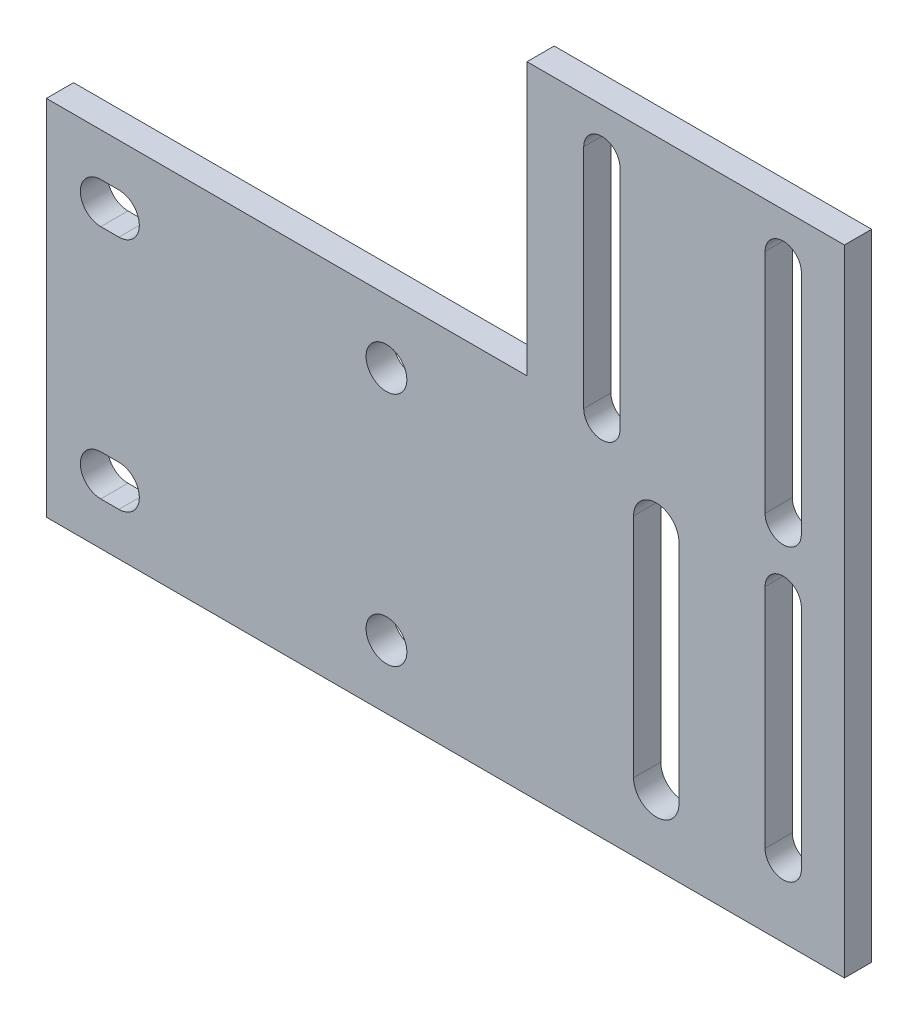
ISO-10303-21;
HEADER;
FILE_DESCRIPTION(('STEP AP214'),'2;1');
FILE_NAME('part.step','',(''),(''),'','','');
FILE_SCHEMA(('AUTOMOTIVE_DESIGN { 1 0 10303 214 1 1 1 1 }'));
ENDSEC;
DATA;
#1=APPLICATION_CONTEXT('core data for automotive mechanical design processes');
#2=APPLICATION_PROTOCOL_DEFINITION('international standard','automotive_design',2000,#1);
#3=PRODUCT_CONTEXT('',#1,'mechanical');
#4=PRODUCT('Part','Part','',(#3));
#5=PRODUCT_RELATED_PRODUCT_CATEGORY('part','',(#4));
#6=PRODUCT_DEFINITION_FORMATION('','',#4);
#7=PRODUCT_DEFINITION_CONTEXT('part definition',#1,'design');
#8=PRODUCT_DEFINITION('design','',#6,#7);
#9=PRODUCT_DEFINITION_SHAPE('','',#8);
#10=(LENGTH_UNIT() NAMED_UNIT(*) SI_UNIT(.MILLI.,.METRE.));
#11=(NAMED_UNIT(*) PLANE_ANGLE_UNIT() SI_UNIT($,.RADIAN.));
#12=(NAMED_UNIT(*) SI_UNIT($,.STERADIAN.) SOLID_ANGLE_UNIT());
#13=UNCERTAINTY_MEASURE_WITH_UNIT(LENGTH_MEASURE(1.E-05),#10,'distance_accuracy_value','');
#14=(GEOMETRIC_REPRESENTATION_CONTEXT(3) GLOBAL_UNCERTAINTY_ASSIGNED_CONTEXT((#13)) GLOBAL_UNIT_ASSIGNED_CONTEXT((#10,
#11,#12)) REPRESENTATION_CONTEXT('',''));
#15=CARTESIAN_POINT('',(0.,0.,0.));
#16=DIRECTION('',(0.,0.,1.));
#17=DIRECTION('',(1.,0.,0.));
#18=AXIS2_PLACEMENT_3D('',#15,#16,#17);
#19=CARTESIAN_POINT('',(0.,0.,3.));
#20=DIRECTION('',(0.,0.,-1.));
#21=DIRECTION('',(-1.,0.,0.));
#22=AXIS2_PLACEMENT_3D('',#19,#20,#21);
#23=PLANE('',#22);
#24=CARTESIAN_POINT('',(59.0000000000004,-11.9999999999996,3.));
#25=DIRECTION('',(0.,0.,1.));
#26=DIRECTION('',(1.,0.,0.));
#27=AXIS2_PLACEMENT_3D('',#24,#25,#26);
#28=CIRCLE('',#27,1.99999999999966);
#29=CARTESIAN_POINT('',(57.0000000000007,-11.9999999999996,3.));
#30=VERTEX_POINT('',#29);
#31=CARTESIAN_POINT('',(61.,-11.9999999999996,3.));
#32=VERTEX_POINT('',#31);
#33=EDGE_CURVE('E285',#30,#32,#28,.T.);
#34=ORIENTED_EDGE('',*,*,#33,.F.);
#35=DIRECTION('',(0.,-1.,0.));
#36=VECTOR('',#35,1.);
#37=CARTESIAN_POINT('',(57.0000000000007,-11.9999999999996,3.));
#38=LINE('',#37,#36);
#39=CARTESIAN_POINT('',(57.0000000000007,13.0000000000004,3.));
#40=VERTEX_POINT('',#39);
#41=EDGE_CURVE('E296',#40,#30,#38,.T.);
#42=ORIENTED_EDGE('',*,*,#41,.F.);
#43=CARTESIAN_POINT('',(59.0000000000003,13.0000000000004,3.));
#44=DIRECTION('',(0.,0.,1.));
#45=DIRECTION('',(1.,0.,0.));
#46=AXIS2_PLACEMENT_3D('',#43,#44,#45);
#47=CIRCLE('',#46,1.99999999999965);
#48=CARTESIAN_POINT('',(61.,13.0000000000004,3.));
#49=VERTEX_POINT('',#48);
#50=EDGE_CURVE('E292',#49,#40,#47,.T.);
#51=ORIENTED_EDGE('',*,*,#50,.F.);
#52=DIRECTION('',(0.,1.,0.));
#53=VECTOR('',#52,1.);
#54=CARTESIAN_POINT('',(61.,-11.9999999999996,3.));
#55=LINE('',#54,#53);
#56=EDGE_CURVE('E288',#32,#49,#55,.T.);
#57=ORIENTED_EDGE('',*,*,#56,.F.);
#58=EDGE_LOOP('',(#34,#42,#51,#57));
#59=FACE_BOUND('',#58,.T.);
#60=CARTESIAN_POINT('',(45.,-12.5,3.));
#61=DIRECTION('',(0.,0.,1.));
#62=DIRECTION('',(1.,0.,0.));
#63=AXIS2_PLACEMENT_3D('',#60,#61,#62);
#64=CIRCLE('',#63,2.5);
#65=CARTESIAN_POINT('',(42.5,-12.5,3.));
#66=VERTEX_POINT('',#65);
#67=CARTESIAN_POINT('',(47.5,-12.5,3.));
#68=VERTEX_POINT('',#67);
#69=EDGE_CURVE('E371',#66,#68,#64,.T.);
#70=ORIENTED_EDGE('',*,*,#69,.F.);
#71=DIRECTION('',(0.,-1.,0.));
#72=VECTOR('',#71,1.);
#73=CARTESIAN_POINT('',(42.5,-12.5,3.));
#74=LINE('',#73,#72);
#75=CARTESIAN_POINT('',(42.5,12.5,3.));
#76=VERTEX_POINT('',#75);
#77=EDGE_CURVE('E382',#76,#66,#74,.T.);
#78=ORIENTED_EDGE('',*,*,#77,.F.);
#79=CARTESIAN_POINT('',(45.,12.5,3.));
#80=DIRECTION('',(0.,0.,1.));
#81=DIRECTION('',(1.,0.,0.));
#82=AXIS2_PLACEMENT_3D('',#79,#80,#81);
#83=CIRCLE('',#82,2.5);
#84=CARTESIAN_POINT('',(47.5,12.5,3.));
#85=VERTEX_POINT('',#84);
#86=EDGE_CURVE('E378',#85,#76,#83,.T.);
#87=ORIENTED_EDGE('',*,*,#86,.F.);
#88=DIRECTION('',(0.,1.,0.));
#89=VECTOR('',#88,1.);
#90=CARTESIAN_POINT('',(47.5,-12.5,3.));
#91=LINE('',#90,#89);
#92=EDGE_CURVE('E374',#68,#85,#91,.T.);
#93=ORIENTED_EDGE('',*,*,#92,.F.);
#94=EDGE_LOOP('',(#70,#78,#87,#93));
#95=FACE_BOUND('',#94,.T.);
#96=CARTESIAN_POINT('',(-14.25,13.,3.));
#97=DIRECTION('',(0.,0.,1.));
#98=DIRECTION('',(1.,0.,0.));
#99=AXIS2_PLACEMENT_3D('',#96,#97,#98);
#100=CIRCLE('',#99,2.25);
#101=CARTESIAN_POINT('',(-14.25,10.75,3.));
#102=VERTEX_POINT('',#101);
#103=CARTESIAN_POINT('',(-14.25,15.25,3.));
#104=VERTEX_POINT('',#103);
#105=EDGE_CURVE('E457',#102,#104,#100,.T.);
#106=ORIENTED_EDGE('',*,*,#105,.F.);
#107=DIRECTION('',(1.,0.,0.));
#108=VECTOR('',#107,1.);
#109=CARTESIAN_POINT('',(-14.25,10.75,3.));
#110=LINE('',#109,#108);
#111=CARTESIAN_POINT('',(-16.25,10.75,3.));
#112=VERTEX_POINT('',#111);
#113=EDGE_CURVE('E468',#112,#102,#110,.T.);
#114=ORIENTED_EDGE('',*,*,#113,.F.);
#115=CARTESIAN_POINT('',(-16.25,13.,3.));
#116=DIRECTION('',(0.,0.,1.));
#117=DIRECTION('',(1.,0.,0.));
#118=AXIS2_PLACEMENT_3D('',#115,#116,#117);
#119=CIRCLE('',#118,2.25);
#120=CARTESIAN_POINT('',(-16.25,15.25,3.));
#121=VERTEX_POINT('',#120);
#122=EDGE_CURVE('E464',#121,#112,#119,.T.);
#123=ORIENTED_EDGE('',*,*,#122,.F.);
#124=DIRECTION('',(-1.,0.,0.));
#125=VECTOR('',#124,1.);
#126=CARTESIAN_POINT('',(-14.25,15.25,3.));
#127=LINE('',#126,#125);
#128=EDGE_CURVE('E460',#104,#121,#127,.T.);
#129=ORIENTED_EDGE('',*,*,#128,.F.);
#130=EDGE_LOOP('',(#106,#114,#123,#129));
#131=FACE_BOUND('',#130,.T.);
#132=DIRECTION('',(-1.,0.,0.));
#133=VECTOR('',#132,1.);
#134=CARTESIAN_POINT('',(30.75,20.,3.));
#135=LINE('',#134,#133);
#136=CARTESIAN_POINT('',(30.75,20.,3.));
#137=VERTEX_POINT('',#136);
#138=CARTESIAN_POINT('',(-22.25,20.,3.));
#139=VERTEX_POINT('',#138);
#140=EDGE_CURVE('E516',#137,#139,#135,.T.);
#141=ORIENTED_EDGE('',*,*,#140,.T.);
#142=DIRECTION('',(0.,-1.,0.));
#143=VECTOR('',#142,1.);
#144=CARTESIAN_POINT('',(-22.25,-20.,3.));
#145=LINE('',#144,#143);
#146=CARTESIAN_POINT('',(-22.25,-20.,3.));
#147=VERTEX_POINT('',#146);
#148=EDGE_CURVE('E520',#139,#147,#145,.T.);
#149=ORIENTED_EDGE('',*,*,#148,.T.);
#150=DIRECTION('',(1.,0.,0.));
#151=VECTOR('',#150,1.);
#152=CARTESIAN_POINT('',(65.75,-20.,3.));
#153=LINE('',#152,#151);
#154=CARTESIAN_POINT('',(65.75,-20.,3.));
#155=VERTEX_POINT('',#154);
#156=EDGE_CURVE('E524',#147,#155,#153,.T.);
#157=ORIENTED_EDGE('',*,*,#156,.T.);
#158=DIRECTION('',(0.,1.,0.));
#159=VECTOR('',#158,1.);
#160=CARTESIAN_POINT('',(65.75,-20.,3.));
#161=LINE('',#160,#159);
#162=CARTESIAN_POINT('',(65.75,50.,3.));
#163=VERTEX_POINT('',#162);
#164=EDGE_CURVE('E527',#155,#163,#161,.T.);
#165=ORIENTED_EDGE('',*,*,#164,.T.);
#166=DIRECTION('',(-1.,0.,0.));
#167=VECTOR('',#166,1.);
#168=CARTESIAN_POINT('',(65.75,50.,3.));
#169=LINE('',#168,#167);
#170=CARTESIAN_POINT('',(30.75,50.,3.));
#171=VERTEX_POINT('',#170);
#172=EDGE_CURVE('E530',#163,#171,#169,.T.);
#173=ORIENTED_EDGE('',*,*,#172,.T.);
#174=DIRECTION('',(0.,-1.,0.));
#175=VECTOR('',#174,1.);
#176=CARTESIAN_POINT('',(30.75,20.,3.));
#177=LINE('',#176,#175);
#178=EDGE_CURVE('E533',#171,#137,#177,.T.);
#179=ORIENTED_EDGE('',*,*,#178,.T.);
#180=EDGE_LOOP('',(#141,#149,#157,#165,#173,#179));
#181=FACE_BOUND('',#180,.T.);
#182=CARTESIAN_POINT('',(15.25,13.,3.));
#183=DIRECTION('',(0.,0.,1.));
#184=DIRECTION('',(1.,0.,0.));
#185=AXIS2_PLACEMENT_3D('',#182,#183,#184);
#186=CIRCLE('',#185,2.25);
#187=CARTESIAN_POINT('',(17.5,13.,3.));
#188=VERTEX_POINT('',#187);
#189=EDGE_CURVE('E508',#188,#188,#186,.T.);
#190=ORIENTED_EDGE('',*,*,#189,.F.);
#191=EDGE_LOOP('',(#190));
#192=FACE_BOUND('',#191,.T.);
#193=CARTESIAN_POINT('',(15.25,-13.,3.));
#194=DIRECTION('',(0.,0.,1.));
#195=DIRECTION('',(1.,0.,0.));
#196=AXIS2_PLACEMENT_3D('',#193,#194,#195);
#197=CIRCLE('',#196,2.25);
#198=CARTESIAN_POINT('',(17.5,-13.,3.));
#199=VERTEX_POINT('',#198);
#200=EDGE_CURVE('E500',#199,#199,#197,.T.);
#201=ORIENTED_EDGE('',*,*,#200,.F.);
#202=EDGE_LOOP('',(#201));
#203=FACE_BOUND('',#202,.T.);
#204=CARTESIAN_POINT('',(-14.25,-13.,3.));
#205=DIRECTION('',(0.,0.,1.));
#206=DIRECTION('',(1.,0.,0.));
#207=AXIS2_PLACEMENT_3D('',#204,#205,#206);
#208=CIRCLE('',#207,2.25);
#209=CARTESIAN_POINT('',(-14.25,-15.25,3.));
#210=VERTEX_POINT('',#209);
#211=CARTESIAN_POINT('',(-14.25,-10.75,3.));
#212=VERTEX_POINT('',#211);
#213=EDGE_CURVE('E414',#210,#212,#208,.T.);
#214=ORIENTED_EDGE('',*,*,#213,.F.);
#215=DIRECTION('',(1.,0.,0.));
#216=VECTOR('',#215,1.);
#217=CARTESIAN_POINT('',(-14.25,-15.25,3.));
#218=LINE('',#217,#216);
#219=CARTESIAN_POINT('',(-16.25,-15.25,3.));
#220=VERTEX_POINT('',#219);
#221=EDGE_CURVE('E425',#220,#210,#218,.T.);
#222=ORIENTED_EDGE('',*,*,#221,.F.);
#223=CARTESIAN_POINT('',(-16.25,-13.,3.));
#224=DIRECTION('',(0.,0.,1.));
#225=DIRECTION('',(1.,0.,0.));
#226=AXIS2_PLACEMENT_3D('',#223,#224,#225);
#227=CIRCLE('',#226,2.25);
#228=CARTESIAN_POINT('',(-16.25,-10.75,3.));
#229=VERTEX_POINT('',#228);
#230=EDGE_CURVE('E421',#229,#220,#227,.T.);
#231=ORIENTED_EDGE('',*,*,#230,.F.);
#232=DIRECTION('',(-1.,0.,0.));
#233=VECTOR('',#232,1.);
#234=CARTESIAN_POINT('',(-14.25,-10.75,3.));
#235=LINE('',#234,#233);
#236=EDGE_CURVE('E417',#212,#229,#235,.T.);
#237=ORIENTED_EDGE('',*,*,#236,.F.);
#238=EDGE_LOOP('',(#214,#222,#231,#237));
#239=FACE_BOUND('',#238,.T.);
#240=CARTESIAN_POINT('',(59.,20.0000000000004,3.));
#241=DIRECTION('',(0.,0.,1.));
#242=DIRECTION('',(1.,0.,0.));
#243=AXIS2_PLACEMENT_3D('',#240,#241,#242);
#244=CIRCLE('',#243,1.99999999999969);
#245=CARTESIAN_POINT('',(57.0000000000003,20.0000000000004,3.));
#246=VERTEX_POINT('',#245);
#247=CARTESIAN_POINT('',(60.9999999999997,20.0000000000004,3.));
#248=VERTEX_POINT('',#247);
#249=EDGE_CURVE('E328',#246,#248,#244,.T.);
#250=ORIENTED_EDGE('',*,*,#249,.F.);
#251=DIRECTION('',(0.,-1.,0.));
#252=VECTOR('',#251,1.);
#253=CARTESIAN_POINT('',(57.0000000000003,20.0000000000004,3.));
#254=LINE('',#253,#252);
#255=CARTESIAN_POINT('',(57.0000000000003,45.0000000000004,3.));
#256=VERTEX_POINT('',#255);
#257=EDGE_CURVE('E339',#256,#246,#254,.T.);
#258=ORIENTED_EDGE('',*,*,#257,.F.);
#259=CARTESIAN_POINT('',(59.,45.0000000000004,3.));
#260=DIRECTION('',(0.,0.,1.));
#261=DIRECTION('',(1.,0.,0.));
#262=AXIS2_PLACEMENT_3D('',#259,#260,#261);
#263=CIRCLE('',#262,1.99999999999968);
#264=CARTESIAN_POINT('',(60.9999999999997,45.0000000000004,3.));
#265=VERTEX_POINT('',#264);
#266=EDGE_CURVE('E335',#265,#256,#263,.T.);
#267=ORIENTED_EDGE('',*,*,#266,.F.);
#268=DIRECTION('',(0.,1.,0.));
#269=VECTOR('',#268,1.);
#270=CARTESIAN_POINT('',(60.9999999999997,20.0000000000004,3.));
#271=LINE('',#270,#269);
#272=EDGE_CURVE('E331',#248,#265,#271,.T.);
#273=ORIENTED_EDGE('',*,*,#272,.F.);
#274=EDGE_LOOP('',(#250,#258,#267,#273));
#275=FACE_BOUND('',#274,.T.);
#276=CARTESIAN_POINT('',(39.0000000000003,20.0000000000003,3.));
#277=DIRECTION('',(0.,0.,1.));
#278=DIRECTION('',(1.,0.,0.));
#279=AXIS2_PLACEMENT_3D('',#276,#277,#278);
#280=CIRCLE('',#279,1.99999999999969);
#281=CARTESIAN_POINT('',(37.0000000000006,20.0000000000003,3.));
#282=VERTEX_POINT('',#281);
#283=CARTESIAN_POINT('',(41.,20.0000000000003,3.));
#284=VERTEX_POINT('',#283);
#285=EDGE_CURVE('E237',#282,#284,#280,.T.);
#286=ORIENTED_EDGE('',*,*,#285,.F.);
#287=DIRECTION('',(0.,-1.,0.));
#288=VECTOR('',#287,1.);
#289=CARTESIAN_POINT('',(37.0000000000006,20.0000000000003,3.));
#290=LINE('',#289,#288);
#291=CARTESIAN_POINT('',(37.0000000000006,45.0000000000003,3.));
#292=VERTEX_POINT('',#291);
#293=EDGE_CURVE('E263',#292,#282,#290,.T.);
#294=ORIENTED_EDGE('',*,*,#293,.F.);
#295=CARTESIAN_POINT('',(39.0000000000003,45.0000000000003,3.));
#296=DIRECTION('',(0.,0.,1.));
#297=DIRECTION('',(1.,0.,0.));
#298=AXIS2_PLACEMENT_3D('',#295,#296,#297);
#299=CIRCLE('',#298,1.99999999999968);
#300=CARTESIAN_POINT('',(41.,45.0000000000003,3.));
#301=VERTEX_POINT('',#300);
#302=EDGE_CURVE('E259',#301,#292,#299,.T.);
#303=ORIENTED_EDGE('',*,*,#302,.F.);
#304=DIRECTION('',(0.,1.,0.));
#305=VECTOR('',#304,1.);
#306=CARTESIAN_POINT('',(41.,20.0000000000003,3.));
#307=LINE('',#306,#305);
#308=EDGE_CURVE('E246',#284,#301,#307,.T.);
#309=ORIENTED_EDGE('',*,*,#308,.F.);
#310=EDGE_LOOP('',(#286,#294,#303,#309));
#311=FACE_BOUND('',#310,.T.);
#312=ADVANCED_FACE('F39',(#59,#95,#131,#181,#192,#203,#239,#275,#311),#23,.F.);
#313=CARTESIAN_POINT('',(0.,0.,0.));
#314=DIRECTION('',(0.,0.,-1.));
#315=DIRECTION('',(-1.,0.,0.));
#316=AXIS2_PLACEMENT_3D('',#313,#314,#315);
#317=PLANE('',#316);
#318=CARTESIAN_POINT('',(15.25,13.,0.));
#319=DIRECTION('',(0.,0.,1.));
#320=DIRECTION('',(1.,0.,0.));
#321=AXIS2_PLACEMENT_3D('',#318,#319,#320);
#322=CIRCLE('',#321,2.25);
#323=CARTESIAN_POINT('',(17.5,13.,0.));
#324=VERTEX_POINT('',#323);
#325=EDGE_CURVE('E504',#324,#324,#322,.T.);
#326=ORIENTED_EDGE('',*,*,#325,.T.);
#327=EDGE_LOOP('',(#326));
#328=FACE_BOUND('',#327,.T.);
#329=DIRECTION('',(-1.,0.,0.));
#330=VECTOR('',#329,1.);
#331=CARTESIAN_POINT('',(30.75,20.,0.));
#332=LINE('',#331,#330);
#333=CARTESIAN_POINT('',(30.75,20.,0.));
#334=VERTEX_POINT('',#333);
#335=CARTESIAN_POINT('',(-22.25,20.,0.));
#336=VERTEX_POINT('',#335);
#337=EDGE_CURVE('E512',#334,#336,#332,.T.);
#338=ORIENTED_EDGE('',*,*,#337,.F.);
#339=DIRECTION('',(0.,-1.,0.));
#340=VECTOR('',#339,1.);
#341=CARTESIAN_POINT('',(30.75,20.,0.));
#342=LINE('',#341,#340);
#343=CARTESIAN_POINT('',(30.75,50.,0.));
#344=VERTEX_POINT('',#343);
#345=EDGE_CURVE('E521',#344,#334,#342,.T.);
#346=ORIENTED_EDGE('',*,*,#345,.F.);
#347=DIRECTION('',(-1.,0.,0.));
#348=VECTOR('',#347,1.);
#349=CARTESIAN_POINT('',(65.75,50.,0.));
#350=LINE('',#349,#348);
#351=CARTESIAN_POINT('',(65.75,50.,0.));
#352=VERTEX_POINT('',#351);
#353=EDGE_CURVE('E550',#352,#344,#350,.T.);
#354=ORIENTED_EDGE('',*,*,#353,.F.);
#355=DIRECTION('',(0.,1.,0.));
#356=VECTOR('',#355,1.);
#357=CARTESIAN_POINT('',(65.75,20.,0.));
#358=LINE('',#357,#356);
#359=CARTESIAN_POINT('',(65.75,-20.,0.));
#360=VERTEX_POINT('',#359);
#361=EDGE_CURVE('E547',#360,#352,#358,.T.);
#362=ORIENTED_EDGE('',*,*,#361,.F.);
#363=DIRECTION('',(1.,0.,0.));
#364=VECTOR('',#363,1.);
#365=CARTESIAN_POINT('',(65.75,-20.,0.));
#366=LINE('',#365,#364);
#367=CARTESIAN_POINT('',(-22.25,-20.,0.));
#368=VERTEX_POINT('',#367);
#369=EDGE_CURVE('E543',#368,#360,#366,.T.);
#370=ORIENTED_EDGE('',*,*,#369,.F.);
#371=DIRECTION('',(0.,-1.,0.));
#372=VECTOR('',#371,1.);
#373=CARTESIAN_POINT('',(-22.25,-20.,0.));
#374=LINE('',#373,#372);
#375=EDGE_CURVE('E540',#336,#368,#374,.T.);
#376=ORIENTED_EDGE('',*,*,#375,.F.);
#377=EDGE_LOOP('',(#338,#346,#354,#362,#370,#376));
#378=FACE_BOUND('',#377,.T.);
#379=CARTESIAN_POINT('',(15.25,-13.,0.));
#380=DIRECTION('',(0.,0.,1.));
#381=DIRECTION('',(1.,0.,0.));
#382=AXIS2_PLACEMENT_3D('',#379,#380,#381);
#383=CIRCLE('',#382,2.25);
#384=CARTESIAN_POINT('',(17.5,-13.,0.));
#385=VERTEX_POINT('',#384);
#386=EDGE_CURVE('E499',#385,#385,#383,.T.);
#387=ORIENTED_EDGE('',*,*,#386,.T.);
#388=EDGE_LOOP('',(#387));
#389=FACE_BOUND('',#388,.T.);
#390=DIRECTION('',(1.,0.,0.));
#391=VECTOR('',#390,1.);
#392=CARTESIAN_POINT('',(-14.25,10.75,0.));
#393=LINE('',#392,#391);
#394=CARTESIAN_POINT('',(-16.25,10.75,0.));
#395=VERTEX_POINT('',#394);
#396=CARTESIAN_POINT('',(-14.25,10.75,0.));
#397=VERTEX_POINT('',#396);
#398=EDGE_CURVE('E461',#395,#397,#393,.T.);
#399=ORIENTED_EDGE('',*,*,#398,.T.);
#400=CARTESIAN_POINT('',(-14.25,13.,0.));
#401=DIRECTION('',(0.,0.,1.));
#402=DIRECTION('',(1.,0.,0.));
#403=AXIS2_PLACEMENT_3D('',#400,#401,#402);
#404=CIRCLE('',#403,2.25);
#405=CARTESIAN_POINT('',(-14.25,15.25,0.));
#406=VERTEX_POINT('',#405);
#407=EDGE_CURVE('E456',#397,#406,#404,.T.);
#408=ORIENTED_EDGE('',*,*,#407,.T.);
#409=DIRECTION('',(-1.,0.,0.));
#410=VECTOR('',#409,1.);
#411=CARTESIAN_POINT('',(-14.25,15.25,0.));
#412=LINE('',#411,#410);
#413=CARTESIAN_POINT('',(-16.25,15.25,0.));
#414=VERTEX_POINT('',#413);
#415=EDGE_CURVE('E475',#406,#414,#412,.T.);
#416=ORIENTED_EDGE('',*,*,#415,.T.);
#417=CARTESIAN_POINT('',(-16.25,13.,0.));
#418=DIRECTION('',(0.,0.,1.));
#419=DIRECTION('',(1.,0.,0.));
#420=AXIS2_PLACEMENT_3D('',#417,#418,#419);
#421=CIRCLE('',#420,2.25);
#422=EDGE_CURVE('E479',#414,#395,#421,.T.);
#423=ORIENTED_EDGE('',*,*,#422,.T.);
#424=EDGE_LOOP('',(#399,#408,#416,#423));
#425=FACE_BOUND('',#424,.T.);
#426=DIRECTION('',(1.,0.,0.));
#427=VECTOR('',#426,1.);
#428=CARTESIAN_POINT('',(-14.25,-15.25,0.));
#429=LINE('',#428,#427);
#430=CARTESIAN_POINT('',(-16.25,-15.25,0.));
#431=VERTEX_POINT('',#430);
#432=CARTESIAN_POINT('',(-14.25,-15.25,0.));
#433=VERTEX_POINT('',#432);
#434=EDGE_CURVE('E418',#431,#433,#429,.T.);
#435=ORIENTED_EDGE('',*,*,#434,.T.);
#436=CARTESIAN_POINT('',(-14.25,-13.,0.));
#437=DIRECTION('',(0.,0.,1.));
#438=DIRECTION('',(1.,0.,0.));
#439=AXIS2_PLACEMENT_3D('',#436,#437,#438);
#440=CIRCLE('',#439,2.25);
#441=CARTESIAN_POINT('',(-14.25,-10.75,0.));
#442=VERTEX_POINT('',#441);
#443=EDGE_CURVE('E413',#433,#442,#440,.T.);
#444=ORIENTED_EDGE('',*,*,#443,.T.);
#445=DIRECTION('',(-1.,0.,0.));
#446=VECTOR('',#445,1.);
#447=CARTESIAN_POINT('',(-14.25,-10.75,0.));
#448=LINE('',#447,#446);
#449=CARTESIAN_POINT('',(-16.25,-10.75,0.));
#450=VERTEX_POINT('',#449);
#451=EDGE_CURVE('E432',#442,#450,#448,.T.);
#452=ORIENTED_EDGE('',*,*,#451,.T.);
#453=CARTESIAN_POINT('',(-16.25,-13.,0.));
#454=DIRECTION('',(0.,0.,1.));
#455=DIRECTION('',(1.,0.,0.));
#456=AXIS2_PLACEMENT_3D('',#453,#454,#455);
#457=CIRCLE('',#456,2.25);
#458=EDGE_CURVE('E436',#450,#431,#457,.T.);
#459=ORIENTED_EDGE('',*,*,#458,.T.);
#460=EDGE_LOOP('',(#435,#444,#452,#459));
#461=FACE_BOUND('',#460,.T.);
#462=DIRECTION('',(0.,-1.,0.));
#463=VECTOR('',#462,1.);
#464=CARTESIAN_POINT('',(42.5,-12.5,0.));
#465=LINE('',#464,#463);
#466=CARTESIAN_POINT('',(42.5,12.5,0.));
#467=VERTEX_POINT('',#466);
#468=CARTESIAN_POINT('',(42.5,-12.5,0.));
#469=VERTEX_POINT('',#468);
#470=EDGE_CURVE('E375',#467,#469,#465,.T.);
#471=ORIENTED_EDGE('',*,*,#470,.T.);
#472=CARTESIAN_POINT('',(45.,-12.5,0.));
#473=DIRECTION('',(0.,0.,1.));
#474=DIRECTION('',(1.,0.,0.));
#475=AXIS2_PLACEMENT_3D('',#472,#473,#474);
#476=CIRCLE('',#475,2.5);
#477=CARTESIAN_POINT('',(47.5,-12.5,0.));
#478=VERTEX_POINT('',#477);
#479=EDGE_CURVE('E370',#469,#478,#476,.T.);
#480=ORIENTED_EDGE('',*,*,#479,.T.);
#481=DIRECTION('',(0.,1.,0.));
#482=VECTOR('',#481,1.);
#483=CARTESIAN_POINT('',(47.5,-12.5,0.));
#484=LINE('',#483,#482);
#485=CARTESIAN_POINT('',(47.5,12.5,0.));
#486=VERTEX_POINT('',#485);
#487=EDGE_CURVE('E389',#478,#486,#484,.T.);
#488=ORIENTED_EDGE('',*,*,#487,.T.);
#489=CARTESIAN_POINT('',(45.,12.5,0.));
#490=DIRECTION('',(0.,0.,1.));
#491=DIRECTION('',(1.,0.,0.));
#492=AXIS2_PLACEMENT_3D('',#489,#490,#491);
#493=CIRCLE('',#492,2.5);
#494=EDGE_CURVE('E393',#486,#467,#493,.T.);
#495=ORIENTED_EDGE('',*,*,#494,.T.);
#496=EDGE_LOOP('',(#471,#480,#488,#495));
#497=FACE_BOUND('',#496,.T.);
#498=DIRECTION('',(0.,-1.,0.));
#499=VECTOR('',#498,1.);
#500=CARTESIAN_POINT('',(57.0000000000003,20.0000000000004,0.));
#501=LINE('',#500,#499);
#502=CARTESIAN_POINT('',(57.0000000000003,45.0000000000004,0.));
#503=VERTEX_POINT('',#502);
#504=CARTESIAN_POINT('',(57.0000000000003,20.0000000000004,0.));
#505=VERTEX_POINT('',#504);
#506=EDGE_CURVE('E332',#503,#505,#501,.T.);
#507=ORIENTED_EDGE('',*,*,#506,.T.);
#508=CARTESIAN_POINT('',(59.,20.0000000000004,0.));
#509=DIRECTION('',(0.,0.,1.));
#510=DIRECTION('',(1.,0.,0.));
#511=AXIS2_PLACEMENT_3D('',#508,#509,#510);
#512=CIRCLE('',#511,1.99999999999969);
#513=CARTESIAN_POINT('',(60.9999999999997,20.0000000000004,0.));
#514=VERTEX_POINT('',#513);
#515=EDGE_CURVE('E327',#505,#514,#512,.T.);
#516=ORIENTED_EDGE('',*,*,#515,.T.);
#517=DIRECTION('',(0.,1.,0.));
#518=VECTOR('',#517,1.);
#519=CARTESIAN_POINT('',(60.9999999999997,20.0000000000004,0.));
#520=LINE('',#519,#518);
#521=CARTESIAN_POINT('',(60.9999999999997,45.0000000000004,0.));
#522=VERTEX_POINT('',#521);
#523=EDGE_CURVE('E346',#514,#522,#520,.T.);
#524=ORIENTED_EDGE('',*,*,#523,.T.);
#525=CARTESIAN_POINT('',(59.,45.0000000000004,0.));
#526=DIRECTION('',(0.,0.,1.));
#527=DIRECTION('',(1.,0.,0.));
#528=AXIS2_PLACEMENT_3D('',#525,#526,#527);
#529=CIRCLE('',#528,1.99999999999968);
#530=EDGE_CURVE('E350',#522,#503,#529,.T.);
#531=ORIENTED_EDGE('',*,*,#530,.T.);
#532=EDGE_LOOP('',(#507,#516,#524,#531));
#533=FACE_BOUND('',#532,.T.);
#534=DIRECTION('',(0.,-1.,0.));
#535=VECTOR('',#534,1.);
#536=CARTESIAN_POINT('',(57.0000000000007,-11.9999999999996,0.));
#537=LINE('',#536,#535);
#538=CARTESIAN_POINT('',(57.0000000000007,13.0000000000004,0.));
#539=VERTEX_POINT('',#538);
#540=CARTESIAN_POINT('',(57.0000000000007,-11.9999999999996,0.));
#541=VERTEX_POINT('',#540);
#542=EDGE_CURVE('E289',#539,#541,#537,.T.);
#543=ORIENTED_EDGE('',*,*,#542,.T.);
#544=CARTESIAN_POINT('',(59.0000000000004,-11.9999999999996,0.));
#545=DIRECTION('',(0.,0.,1.));
#546=DIRECTION('',(1.,0.,0.));
#547=AXIS2_PLACEMENT_3D('',#544,#545,#546);
#548=CIRCLE('',#547,1.99999999999966);
#549=CARTESIAN_POINT('',(61.,-11.9999999999996,0.));
#550=VERTEX_POINT('',#549);
#551=EDGE_CURVE('E255',#541,#550,#548,.T.);
#552=ORIENTED_EDGE('',*,*,#551,.T.);
#553=DIRECTION('',(0.,1.,0.));
#554=VECTOR('',#553,1.);
#555=CARTESIAN_POINT('',(61.,-11.9999999999996,0.));
#556=LINE('',#555,#554);
#557=CARTESIAN_POINT('',(61.,13.0000000000004,0.));
#558=VERTEX_POINT('',#557);
#559=EDGE_CURVE('E303',#550,#558,#556,.T.);
#560=ORIENTED_EDGE('',*,*,#559,.T.);
#561=CARTESIAN_POINT('',(59.0000000000003,13.0000000000004,0.));
#562=DIRECTION('',(0.,0.,1.));
#563=DIRECTION('',(1.,0.,0.));
#564=AXIS2_PLACEMENT_3D('',#561,#562,#563);
#565=CIRCLE('',#564,1.99999999999965);
#566=EDGE_CURVE('E307',#558,#539,#565,.T.);
#567=ORIENTED_EDGE('',*,*,#566,.T.);
#568=EDGE_LOOP('',(#543,#552,#560,#567));
#569=FACE_BOUND('',#568,.T.);
#570=DIRECTION('',(0.,-1.,0.));
#571=VECTOR('',#570,1.);
#572=CARTESIAN_POINT('',(37.0000000000006,20.0000000000003,0.));
#573=LINE('',#572,#571);
#574=CARTESIAN_POINT('',(37.0000000000006,45.0000000000003,0.));
#575=VERTEX_POINT('',#574);
#576=CARTESIAN_POINT('',(37.0000000000006,20.0000000000003,0.));
#577=VERTEX_POINT('',#576);
#578=EDGE_CURVE('E247',#575,#577,#573,.T.);
#579=ORIENTED_EDGE('',*,*,#578,.T.);
#580=CARTESIAN_POINT('',(39.0000000000003,20.0000000000003,0.));
#581=DIRECTION('',(0.,0.,1.));
#582=DIRECTION('',(1.,0.,0.));
#583=AXIS2_PLACEMENT_3D('',#580,#581,#582);
#584=CIRCLE('',#583,1.99999999999969);
#585=CARTESIAN_POINT('',(41.,20.0000000000003,0.));
#586=VERTEX_POINT('',#585);
#587=EDGE_CURVE('E63',#577,#586,#584,.T.);
#588=ORIENTED_EDGE('',*,*,#587,.T.);
#589=DIRECTION('',(0.,1.,0.));
#590=VECTOR('',#589,1.);
#591=CARTESIAN_POINT('',(41.,20.0000000000003,0.));
#592=LINE('',#591,#590);
#593=CARTESIAN_POINT('',(41.,45.0000000000003,0.));
#594=VERTEX_POINT('',#593);
#595=EDGE_CURVE('E253',#586,#594,#592,.T.);
#596=ORIENTED_EDGE('',*,*,#595,.T.);
#597=CARTESIAN_POINT('',(39.0000000000003,45.0000000000003,0.));
#598=DIRECTION('',(0.,0.,1.));
#599=DIRECTION('',(1.,0.,0.));
#600=AXIS2_PLACEMENT_3D('',#597,#598,#599);
#601=CIRCLE('',#600,1.99999999999968);
#602=EDGE_CURVE('E272',#594,#575,#601,.T.);
#603=ORIENTED_EDGE('',*,*,#602,.T.);
#604=EDGE_LOOP('',(#579,#588,#596,#603));
#605=FACE_BOUND('',#604,.T.);
#606=ADVANCED_FACE('F580',(#328,#378,#389,#425,#461,#497,#533,#569,#605),#317,.T.);
#607=CARTESIAN_POINT('',(30.75,20.,3.));
#608=DIRECTION('',(0.,-1.,0.));
#609=DIRECTION('',(0.,0.,-1.));
#610=AXIS2_PLACEMENT_3D('',#607,#608,#609);
#611=PLANE('',#610);
#612=ORIENTED_EDGE('',*,*,#337,.T.);
#613=DIRECTION('',(0.,0.,-1.));
#614=VECTOR('',#613,1.);
#615=CARTESIAN_POINT('',(-22.25,20.,3.));
#616=LINE('',#615,#614);
#617=EDGE_CURVE('E11',#139,#336,#616,.T.);
#618=ORIENTED_EDGE('',*,*,#617,.F.);
#619=ORIENTED_EDGE('',*,*,#140,.F.);
#620=DIRECTION('',(0.,0.,-1.));
#621=VECTOR('',#620,1.);
#622=CARTESIAN_POINT('',(30.75,20.,3.));
#623=LINE('',#622,#621);
#624=EDGE_CURVE('E536',#137,#334,#623,.T.);
#625=ORIENTED_EDGE('',*,*,#624,.T.);
#626=EDGE_LOOP('',(#612,#618,#619,#625));
#627=FACE_BOUND('',#626,.T.);
#628=ADVANCED_FACE('F41',(#627),#611,.F.);
#629=CARTESIAN_POINT('',(-22.25,-20.,3.));
#630=DIRECTION('',(1.,0.,0.));
#631=DIRECTION('',(0.,0.,-1.));
#632=AXIS2_PLACEMENT_3D('',#629,#630,#631);
#633=PLANE('',#632);
#634=ORIENTED_EDGE('',*,*,#375,.T.);
#635=DIRECTION('',(0.,0.,-1.));
#636=VECTOR('',#635,1.);
#637=CARTESIAN_POINT('',(-22.25,-20.,3.));
#638=LINE('',#637,#636);
#639=EDGE_CURVE('E48',#147,#368,#638,.T.);
#640=ORIENTED_EDGE('',*,*,#639,.F.);
#641=ORIENTED_EDGE('',*,*,#148,.F.);
#642=ORIENTED_EDGE('',*,*,#617,.T.);
#643=EDGE_LOOP('',(#634,#640,#641,#642));
#644=FACE_BOUND('',#643,.T.);
#645=ADVANCED_FACE('F598',(#644),#633,.F.);
#646=CARTESIAN_POINT('',(65.75,-20.,3.));
#647=DIRECTION('',(0.,1.,0.));
#648=DIRECTION('',(-1.,0.,0.));
#649=AXIS2_PLACEMENT_3D('',#646,#647,#648);
#650=PLANE('',#649);
#651=ORIENTED_EDGE('',*,*,#369,.T.);
#652=DIRECTION('',(0.,0.,-1.));
#653=VECTOR('',#652,1.);
#654=CARTESIAN_POINT('',(65.75,-20.,3.));
#655=LINE('',#654,#653);
#656=EDGE_CURVE('E566',#155,#360,#655,.T.);
#657=ORIENTED_EDGE('',*,*,#656,.F.);
#658=ORIENTED_EDGE('',*,*,#156,.F.);
#659=ORIENTED_EDGE('',*,*,#639,.T.);
#660=EDGE_LOOP('',(#651,#657,#658,#659));
#661=FACE_BOUND('',#660,.T.);
#662=ADVANCED_FACE('F575',(#661),#650,.F.);
#663=CARTESIAN_POINT('',(65.75,20.,3.));
#664=DIRECTION('',(-1.,0.,0.));
#665=DIRECTION('',(0.,0.,1.));
#666=AXIS2_PLACEMENT_3D('',#663,#664,#665);
#667=PLANE('',#666);
#668=ORIENTED_EDGE('',*,*,#361,.T.);
#669=DIRECTION('',(0.,0.,-1.));
#670=VECTOR('',#669,1.);
#671=CARTESIAN_POINT('',(65.75,50.,3.));
#672=LINE('',#671,#670);
#673=EDGE_CURVE('E562',#163,#352,#672,.T.);
#674=ORIENTED_EDGE('',*,*,#673,.F.);
#675=ORIENTED_EDGE('',*,*,#164,.F.);
#676=ORIENTED_EDGE('',*,*,#656,.T.);
#677=EDGE_LOOP('',(#668,#674,#675,#676));
#678=FACE_BOUND('',#677,.T.);
#679=ADVANCED_FACE('F586',(#678),#667,.F.);
#680=CARTESIAN_POINT('',(65.75,50.,3.));
#681=DIRECTION('',(0.,-1.,0.));
#682=DIRECTION('',(1.,0.,0.));
#683=AXIS2_PLACEMENT_3D('',#680,#681,#682);
#684=PLANE('',#683);
#685=ORIENTED_EDGE('',*,*,#353,.T.);
#686=DIRECTION('',(0.,0.,-1.));
#687=VECTOR('',#686,1.);
#688=CARTESIAN_POINT('',(30.75,50.,3.));
#689=LINE('',#688,#687);
#690=EDGE_CURVE('E558',#171,#344,#689,.T.);
#691=ORIENTED_EDGE('',*,*,#690,.F.);
#692=ORIENTED_EDGE('',*,*,#172,.F.);
#693=ORIENTED_EDGE('',*,*,#673,.T.);
#694=EDGE_LOOP('',(#685,#691,#692,#693));
#695=FACE_BOUND('',#694,.T.);
#696=ADVANCED_FACE('F590',(#695),#684,.F.);
#697=CARTESIAN_POINT('',(30.75,20.,3.));
#698=DIRECTION('',(1.,0.,0.));
#699=DIRECTION('',(0.,1.,0.));
#700=AXIS2_PLACEMENT_3D('',#697,#698,#699);
#701=PLANE('',#700);
#702=ORIENTED_EDGE('',*,*,#345,.T.);
#703=ORIENTED_EDGE('',*,*,#624,.F.);
#704=ORIENTED_EDGE('',*,*,#178,.F.);
#705=ORIENTED_EDGE('',*,*,#690,.T.);
#706=EDGE_LOOP('',(#702,#703,#704,#705));
#707=FACE_BOUND('',#706,.T.);
#708=ADVANCED_FACE('F601',(#707),#701,.F.);
#709=CARTESIAN_POINT('',(15.25,13.,3.));
#710=DIRECTION('',(0.,0.,-1.));
#711=DIRECTION('',(-1.,0.,0.));
#712=AXIS2_PLACEMENT_3D('',#709,#710,#711);
#713=CYLINDRICAL_SURFACE('',#712,2.25);
#714=ORIENTED_EDGE('',*,*,#189,.T.);
#715=EDGE_LOOP('',(#714));
#716=FACE_BOUND('',#715,.T.);
#717=ORIENTED_EDGE('',*,*,#325,.F.);
#718=EDGE_LOOP('',(#717));
#719=FACE_BOUND('',#718,.T.);
#720=ADVANCED_FACE('F603',(#716,#719),#713,.F.);
#721=CARTESIAN_POINT('',(15.25,-13.,3.));
#722=DIRECTION('',(0.,0.,-1.));
#723=DIRECTION('',(-1.,0.,0.));
#724=AXIS2_PLACEMENT_3D('',#721,#722,#723);
#725=CYLINDRICAL_SURFACE('',#724,2.25);
#726=ORIENTED_EDGE('',*,*,#200,.T.);
#727=EDGE_LOOP('',(#726));
#728=FACE_BOUND('',#727,.T.);
#729=ORIENTED_EDGE('',*,*,#386,.F.);
#730=EDGE_LOOP('',(#729));
#731=FACE_BOUND('',#730,.T.);
#732=ADVANCED_FACE('F609',(#728,#731),#725,.F.);
#733=CARTESIAN_POINT('',(-14.25,13.,3.));
#734=DIRECTION('',(0.,0.,-1.));
#735=DIRECTION('',(-1.,0.,0.));
#736=AXIS2_PLACEMENT_3D('',#733,#734,#735);
#737=CYLINDRICAL_SURFACE('',#736,2.25);
#738=ORIENTED_EDGE('',*,*,#407,.F.);
#739=DIRECTION('',(0.,0.,-1.));
#740=VECTOR('',#739,1.);
#741=CARTESIAN_POINT('',(-14.25,10.75,3.));
#742=LINE('',#741,#740);
#743=EDGE_CURVE('E471',#102,#397,#742,.T.);
#744=ORIENTED_EDGE('',*,*,#743,.F.);
#745=ORIENTED_EDGE('',*,*,#105,.T.);
#746=DIRECTION('',(0.,0.,-1.));
#747=VECTOR('',#746,1.);
#748=CARTESIAN_POINT('',(-14.25,15.25,3.));
#749=LINE('',#748,#747);
#750=EDGE_CURVE('E495',#104,#406,#749,.T.);
#751=ORIENTED_EDGE('',*,*,#750,.T.);
#752=EDGE_LOOP('',(#738,#744,#745,#751));
#753=FACE_BOUND('',#752,.T.);
#754=ADVANCED_FACE('F626',(#753),#737,.F.);
#755=CARTESIAN_POINT('',(-14.25,15.25,3.));
#756=DIRECTION('',(0.,-1.,0.));
#757=DIRECTION('',(0.,0.,-1.));
#758=AXIS2_PLACEMENT_3D('',#755,#756,#757);
#759=PLANE('',#758);
#760=ORIENTED_EDGE('',*,*,#415,.F.);
#761=ORIENTED_EDGE('',*,*,#750,.F.);
#762=ORIENTED_EDGE('',*,*,#128,.T.);
#763=DIRECTION('',(0.,0.,-1.));
#764=VECTOR('',#763,1.);
#765=CARTESIAN_POINT('',(-16.25,15.25,3.));
#766=LINE('',#765,#764);
#767=EDGE_CURVE('E492',#121,#414,#766,.T.);
#768=ORIENTED_EDGE('',*,*,#767,.T.);
#769=EDGE_LOOP('',(#760,#761,#762,#768));
#770=FACE_BOUND('',#769,.T.);
#771=ADVANCED_FACE('F630',(#770),#759,.T.);
#772=CARTESIAN_POINT('',(-16.25,13.,3.));
#773=DIRECTION('',(0.,0.,-1.));
#774=DIRECTION('',(-1.,0.,0.));
#775=AXIS2_PLACEMENT_3D('',#772,#773,#774);
#776=CYLINDRICAL_SURFACE('',#775,2.25);
#777=ORIENTED_EDGE('',*,*,#422,.F.);
#778=ORIENTED_EDGE('',*,*,#767,.F.);
#779=ORIENTED_EDGE('',*,*,#122,.T.);
#780=DIRECTION('',(0.,0.,-1.));
#781=VECTOR('',#780,1.);
#782=CARTESIAN_POINT('',(-16.25,10.75,3.));
#783=LINE('',#782,#781);
#784=EDGE_CURVE('E489',#112,#395,#783,.T.);
#785=ORIENTED_EDGE('',*,*,#784,.T.);
#786=EDGE_LOOP('',(#777,#778,#779,#785));
#787=FACE_BOUND('',#786,.T.);
#788=ADVANCED_FACE('F634',(#787),#776,.F.);
#789=CARTESIAN_POINT('',(-14.25,10.75,3.));
#790=DIRECTION('',(0.,1.,0.));
#791=DIRECTION('',(0.,0.,1.));
#792=AXIS2_PLACEMENT_3D('',#789,#790,#791);
#793=PLANE('',#792);
#794=ORIENTED_EDGE('',*,*,#398,.F.);
#795=ORIENTED_EDGE('',*,*,#784,.F.);
#796=ORIENTED_EDGE('',*,*,#113,.T.);
#797=ORIENTED_EDGE('',*,*,#743,.T.);
#798=EDGE_LOOP('',(#794,#795,#796,#797));
#799=FACE_BOUND('',#798,.T.);
#800=ADVANCED_FACE('F638',(#799),#793,.T.);
#801=CARTESIAN_POINT('',(-14.25,-13.,3.));
#802=DIRECTION('',(0.,0.,-1.));
#803=DIRECTION('',(-1.,0.,0.));
#804=AXIS2_PLACEMENT_3D('',#801,#802,#803);
#805=CYLINDRICAL_SURFACE('',#804,2.25);
#806=ORIENTED_EDGE('',*,*,#443,.F.);
#807=DIRECTION('',(0.,0.,-1.));
#808=VECTOR('',#807,1.);
#809=CARTESIAN_POINT('',(-14.25,-15.25,3.));
#810=LINE('',#809,#808);
#811=EDGE_CURVE('E428',#210,#433,#810,.T.);
#812=ORIENTED_EDGE('',*,*,#811,.F.);
#813=ORIENTED_EDGE('',*,*,#213,.T.);
#814=DIRECTION('',(0.,0.,-1.));
#815=VECTOR('',#814,1.);
#816=CARTESIAN_POINT('',(-14.25,-10.75,3.));
#817=LINE('',#816,#815);
#818=EDGE_CURVE('E452',#212,#442,#817,.T.);
#819=ORIENTED_EDGE('',*,*,#818,.T.);
#820=EDGE_LOOP('',(#806,#812,#813,#819));
#821=FACE_BOUND('',#820,.T.);
#822=ADVANCED_FACE('F642',(#821),#805,.F.);
#823=CARTESIAN_POINT('',(-14.25,-10.75,3.));
#824=DIRECTION('',(0.,-1.,0.));
#825=DIRECTION('',(0.,0.,-1.));
#826=AXIS2_PLACEMENT_3D('',#823,#824,#825);
#827=PLANE('',#826);
#828=ORIENTED_EDGE('',*,*,#451,.F.);
#829=ORIENTED_EDGE('',*,*,#818,.F.);
#830=ORIENTED_EDGE('',*,*,#236,.T.);
#831=DIRECTION('',(0.,0.,-1.));
#832=VECTOR('',#831,1.);
#833=CARTESIAN_POINT('',(-16.25,-10.75,3.));
#834=LINE('',#833,#832);
#835=EDGE_CURVE('E449',#229,#450,#834,.T.);
#836=ORIENTED_EDGE('',*,*,#835,.T.);
#837=EDGE_LOOP('',(#828,#829,#830,#836));
#838=FACE_BOUND('',#837,.T.);
#839=ADVANCED_FACE('F646',(#838),#827,.T.);
#840=CARTESIAN_POINT('',(-16.25,-13.,3.));
#841=DIRECTION('',(0.,0.,-1.));
#842=DIRECTION('',(-1.,0.,0.));
#843=AXIS2_PLACEMENT_3D('',#840,#841,#842);
#844=CYLINDRICAL_SURFACE('',#843,2.25);
#845=ORIENTED_EDGE('',*,*,#458,.F.);
#846=ORIENTED_EDGE('',*,*,#835,.F.);
#847=ORIENTED_EDGE('',*,*,#230,.T.);
#848=DIRECTION('',(0.,0.,-1.));
#849=VECTOR('',#848,1.);
#850=CARTESIAN_POINT('',(-16.25,-15.25,3.));
#851=LINE('',#850,#849);
#852=EDGE_CURVE('E446',#220,#431,#851,.T.);
#853=ORIENTED_EDGE('',*,*,#852,.T.);
#854=EDGE_LOOP('',(#845,#846,#847,#853));
#855=FACE_BOUND('',#854,.T.);
#856=ADVANCED_FACE('F650',(#855),#844,.F.);
#857=CARTESIAN_POINT('',(-14.25,-15.25,3.));
#858=DIRECTION('',(0.,1.,0.));
#859=DIRECTION('',(0.,0.,1.));
#860=AXIS2_PLACEMENT_3D('',#857,#858,#859);
#861=PLANE('',#860);
#862=ORIENTED_EDGE('',*,*,#434,.F.);
#863=ORIENTED_EDGE('',*,*,#852,.F.);
#864=ORIENTED_EDGE('',*,*,#221,.T.);
#865=ORIENTED_EDGE('',*,*,#811,.T.);
#866=EDGE_LOOP('',(#862,#863,#864,#865));
#867=FACE_BOUND('',#866,.T.);
#868=ADVANCED_FACE('F654',(#867),#861,.T.);
#869=CARTESIAN_POINT('',(45.,-12.5,3.));
#870=DIRECTION('',(0.,0.,-1.));
#871=DIRECTION('',(-1.,0.,0.));
#872=AXIS2_PLACEMENT_3D('',#869,#870,#871);
#873=CYLINDRICAL_SURFACE('',#872,2.5);
#874=ORIENTED_EDGE('',*,*,#479,.F.);
#875=DIRECTION('',(0.,0.,-1.));
#876=VECTOR('',#875,1.);
#877=CARTESIAN_POINT('',(42.5,-12.5,3.));
#878=LINE('',#877,#876);
#879=EDGE_CURVE('E385',#66,#469,#878,.T.);
#880=ORIENTED_EDGE('',*,*,#879,.F.);
#881=ORIENTED_EDGE('',*,*,#69,.T.);
#882=DIRECTION('',(0.,0.,-1.));
#883=VECTOR('',#882,1.);
#884=CARTESIAN_POINT('',(47.5,-12.5,3.));
#885=LINE('',#884,#883);
#886=EDGE_CURVE('E409',#68,#478,#885,.T.);
#887=ORIENTED_EDGE('',*,*,#886,.T.);
#888=EDGE_LOOP('',(#874,#880,#881,#887));
#889=FACE_BOUND('',#888,.T.);
#890=ADVANCED_FACE('F658',(#889),#873,.F.);
#891=CARTESIAN_POINT('',(47.5,-12.5,3.));
#892=DIRECTION('',(-1.,0.,0.));
#893=DIRECTION('',(0.,0.,1.));
#894=AXIS2_PLACEMENT_3D('',#891,#892,#893);
#895=PLANE('',#894);
#896=ORIENTED_EDGE('',*,*,#487,.F.);
#897=ORIENTED_EDGE('',*,*,#886,.F.);
#898=ORIENTED_EDGE('',*,*,#92,.T.);
#899=DIRECTION('',(0.,0.,-1.));
#900=VECTOR('',#899,1.);
#901=CARTESIAN_POINT('',(47.5,12.5,3.));
#902=LINE('',#901,#900);
#903=EDGE_CURVE('E406',#85,#486,#902,.T.);
#904=ORIENTED_EDGE('',*,*,#903,.T.);
#905=EDGE_LOOP('',(#896,#897,#898,#904));
#906=FACE_BOUND('',#905,.T.);
#907=ADVANCED_FACE('F662',(#906),#895,.T.);
#908=CARTESIAN_POINT('',(45.,12.5,3.));
#909=DIRECTION('',(0.,0.,-1.));
#910=DIRECTION('',(-1.,0.,0.));
#911=AXIS2_PLACEMENT_3D('',#908,#909,#910);
#912=CYLINDRICAL_SURFACE('',#911,2.5);
#913=ORIENTED_EDGE('',*,*,#494,.F.);
#914=ORIENTED_EDGE('',*,*,#903,.F.);
#915=ORIENTED_EDGE('',*,*,#86,.T.);
#916=DIRECTION('',(0.,0.,-1.));
#917=VECTOR('',#916,1.);
#918=CARTESIAN_POINT('',(42.5,12.5,3.));
#919=LINE('',#918,#917);
#920=EDGE_CURVE('E403',#76,#467,#919,.T.);
#921=ORIENTED_EDGE('',*,*,#920,.T.);
#922=EDGE_LOOP('',(#913,#914,#915,#921));
#923=FACE_BOUND('',#922,.T.);
#924=ADVANCED_FACE('F666',(#923),#912,.F.);
#925=CARTESIAN_POINT('',(42.5,-12.5,3.));
#926=DIRECTION('',(1.,0.,0.));
#927=DIRECTION('',(0.,0.,-1.));
#928=AXIS2_PLACEMENT_3D('',#925,#926,#927);
#929=PLANE('',#928);
#930=ORIENTED_EDGE('',*,*,#470,.F.);
#931=ORIENTED_EDGE('',*,*,#920,.F.);
#932=ORIENTED_EDGE('',*,*,#77,.T.);
#933=ORIENTED_EDGE('',*,*,#879,.T.);
#934=EDGE_LOOP('',(#930,#931,#932,#933));
#935=FACE_BOUND('',#934,.T.);
#936=ADVANCED_FACE('F670',(#935),#929,.T.);
#937=CARTESIAN_POINT('',(59.,20.0000000000004,3.));
#938=DIRECTION('',(0.,0.,-1.));
#939=DIRECTION('',(-1.,0.,0.));
#940=AXIS2_PLACEMENT_3D('',#937,#938,#939);
#941=CYLINDRICAL_SURFACE('',#940,1.99999999999969);
#942=ORIENTED_EDGE('',*,*,#515,.F.);
#943=DIRECTION('',(0.,0.,-1.));
#944=VECTOR('',#943,1.);
#945=CARTESIAN_POINT('',(57.0000000000003,20.0000000000004,3.));
#946=LINE('',#945,#944);
#947=EDGE_CURVE('E342',#246,#505,#946,.T.);
#948=ORIENTED_EDGE('',*,*,#947,.F.);
#949=ORIENTED_EDGE('',*,*,#249,.T.);
#950=DIRECTION('',(0.,0.,-1.));
#951=VECTOR('',#950,1.);
#952=CARTESIAN_POINT('',(60.9999999999997,20.0000000000004,3.));
#953=LINE('',#952,#951);
#954=EDGE_CURVE('E366',#248,#514,#953,.T.);
#955=ORIENTED_EDGE('',*,*,#954,.T.);
#956=EDGE_LOOP('',(#942,#948,#949,#955));
#957=FACE_BOUND('',#956,.T.);
#958=ADVANCED_FACE('F674',(#957),#941,.F.);
#959=CARTESIAN_POINT('',(60.9999999999997,20.0000000000004,3.));
#960=DIRECTION('',(-1.,0.,0.));
#961=DIRECTION('',(0.,-1.,0.));
#962=AXIS2_PLACEMENT_3D('',#959,#960,#961);
#963=PLANE('',#962);
#964=ORIENTED_EDGE('',*,*,#523,.F.);
#965=ORIENTED_EDGE('',*,*,#954,.F.);
#966=ORIENTED_EDGE('',*,*,#272,.T.);
#967=DIRECTION('',(0.,0.,-1.));
#968=VECTOR('',#967,1.);
#969=CARTESIAN_POINT('',(60.9999999999997,45.0000000000004,3.));
#970=LINE('',#969,#968);
#971=EDGE_CURVE('E363',#265,#522,#970,.T.);
#972=ORIENTED_EDGE('',*,*,#971,.T.);
#973=EDGE_LOOP('',(#964,#965,#966,#972));
#974=FACE_BOUND('',#973,.T.);
#975=ADVANCED_FACE('F678',(#974),#963,.T.);
#976=CARTESIAN_POINT('',(59.,45.0000000000004,3.));
#977=DIRECTION('',(0.,0.,-1.));
#978=DIRECTION('',(-1.,0.,0.));
#979=AXIS2_PLACEMENT_3D('',#976,#977,#978);
#980=CYLINDRICAL_SURFACE('',#979,1.99999999999968);
#981=ORIENTED_EDGE('',*,*,#530,.F.);
#982=ORIENTED_EDGE('',*,*,#971,.F.);
#983=ORIENTED_EDGE('',*,*,#266,.T.);
#984=DIRECTION('',(0.,0.,-1.));
#985=VECTOR('',#984,1.);
#986=CARTESIAN_POINT('',(57.0000000000003,45.0000000000004,3.));
#987=LINE('',#986,#985);
#988=EDGE_CURVE('E360',#256,#503,#987,.T.);
#989=ORIENTED_EDGE('',*,*,#988,.T.);
#990=EDGE_LOOP('',(#981,#982,#983,#989));
#991=FACE_BOUND('',#990,.T.);
#992=ADVANCED_FACE('F682',(#991),#980,.F.);
#993=CARTESIAN_POINT('',(57.0000000000003,20.0000000000004,3.));
#994=DIRECTION('',(1.,0.,0.));
#995=DIRECTION('',(0.,1.,0.));
#996=AXIS2_PLACEMENT_3D('',#993,#994,#995);
#997=PLANE('',#996);
#998=ORIENTED_EDGE('',*,*,#506,.F.);
#999=ORIENTED_EDGE('',*,*,#988,.F.);
#1000=ORIENTED_EDGE('',*,*,#257,.T.);
#1001=ORIENTED_EDGE('',*,*,#947,.T.);
#1002=EDGE_LOOP('',(#998,#999,#1000,#1001));
#1003=FACE_BOUND('',#1002,.T.);
#1004=ADVANCED_FACE('F686',(#1003),#997,.T.);
#1005=CARTESIAN_POINT('',(59.0000000000004,-11.9999999999996,3.));
#1006=DIRECTION('',(0.,0.,-1.));
#1007=DIRECTION('',(-1.,0.,0.));
#1008=AXIS2_PLACEMENT_3D('',#1005,#1006,#1007);
#1009=CYLINDRICAL_SURFACE('',#1008,1.99999999999966);
#1010=ORIENTED_EDGE('',*,*,#551,.F.);
#1011=DIRECTION('',(0.,0.,-1.));
#1012=VECTOR('',#1011,1.);
#1013=CARTESIAN_POINT('',(57.0000000000007,-11.9999999999996,3.));
#1014=LINE('',#1013,#1012);
#1015=EDGE_CURVE('E299',#30,#541,#1014,.T.);
#1016=ORIENTED_EDGE('',*,*,#1015,.F.);
#1017=ORIENTED_EDGE('',*,*,#33,.T.);
#1018=DIRECTION('',(0.,0.,-1.));
#1019=VECTOR('',#1018,1.);
#1020=CARTESIAN_POINT('',(61.,-11.9999999999996,3.));
#1021=LINE('',#1020,#1019);
#1022=EDGE_CURVE('E323',#32,#550,#1021,.T.);
#1023=ORIENTED_EDGE('',*,*,#1022,.T.);
#1024=EDGE_LOOP('',(#1010,#1016,#1017,#1023));
#1025=FACE_BOUND('',#1024,.T.);
#1026=ADVANCED_FACE('F690',(#1025),#1009,.F.);
#1027=CARTESIAN_POINT('',(61.,-11.9999999999996,3.));
#1028=DIRECTION('',(-1.,0.,0.));
#1029=DIRECTION('',(0.,-1.,0.));
#1030=AXIS2_PLACEMENT_3D('',#1027,#1028,#1029);
#1031=PLANE('',#1030);
#1032=ORIENTED_EDGE('',*,*,#559,.F.);
#1033=ORIENTED_EDGE('',*,*,#1022,.F.);
#1034=ORIENTED_EDGE('',*,*,#56,.T.);
#1035=DIRECTION('',(0.,0.,-1.));
#1036=VECTOR('',#1035,1.);
#1037=CARTESIAN_POINT('',(61.,13.0000000000004,3.));
#1038=LINE('',#1037,#1036);
#1039=EDGE_CURVE('E320',#49,#558,#1038,.T.);
#1040=ORIENTED_EDGE('',*,*,#1039,.T.);
#1041=EDGE_LOOP('',(#1032,#1033,#1034,#1040));
#1042=FACE_BOUND('',#1041,.T.);
#1043=ADVANCED_FACE('F694',(#1042),#1031,.T.);
#1044=CARTESIAN_POINT('',(59.0000000000003,13.0000000000004,3.));
#1045=DIRECTION('',(0.,0.,-1.));
#1046=DIRECTION('',(-1.,0.,0.));
#1047=AXIS2_PLACEMENT_3D('',#1044,#1045,#1046);
#1048=CYLINDRICAL_SURFACE('',#1047,1.99999999999965);
#1049=ORIENTED_EDGE('',*,*,#566,.F.);
#1050=ORIENTED_EDGE('',*,*,#1039,.F.);
#1051=ORIENTED_EDGE('',*,*,#50,.T.);
#1052=DIRECTION('',(0.,0.,-1.));
#1053=VECTOR('',#1052,1.);
#1054=CARTESIAN_POINT('',(57.0000000000007,13.0000000000004,3.));
#1055=LINE('',#1054,#1053);
#1056=EDGE_CURVE('E317',#40,#539,#1055,.T.);
#1057=ORIENTED_EDGE('',*,*,#1056,.T.);
#1058=EDGE_LOOP('',(#1049,#1050,#1051,#1057));
#1059=FACE_BOUND('',#1058,.T.);
#1060=ADVANCED_FACE('F698',(#1059),#1048,.F.);
#1061=CARTESIAN_POINT('',(57.0000000000007,-11.9999999999996,3.));
#1062=DIRECTION('',(1.,0.,0.));
#1063=DIRECTION('',(0.,1.,0.));
#1064=AXIS2_PLACEMENT_3D('',#1061,#1062,#1063);
#1065=PLANE('',#1064);
#1066=ORIENTED_EDGE('',*,*,#542,.F.);
#1067=ORIENTED_EDGE('',*,*,#1056,.F.);
#1068=ORIENTED_EDGE('',*,*,#41,.T.);
#1069=ORIENTED_EDGE('',*,*,#1015,.T.);
#1070=EDGE_LOOP('',(#1066,#1067,#1068,#1069));
#1071=FACE_BOUND('',#1070,.T.);
#1072=ADVANCED_FACE('F702',(#1071),#1065,.T.);
#1073=CARTESIAN_POINT('',(39.0000000000003,20.0000000000003,3.));
#1074=DIRECTION('',(0.,0.,-1.));
#1075=DIRECTION('',(-1.,0.,0.));
#1076=AXIS2_PLACEMENT_3D('',#1073,#1074,#1075);
#1077=CYLINDRICAL_SURFACE('',#1076,1.99999999999969);
#1078=ORIENTED_EDGE('',*,*,#587,.F.);
#1079=DIRECTION('',(0.,0.,-1.));
#1080=VECTOR('',#1079,1.);
#1081=CARTESIAN_POINT('',(37.0000000000006,20.0000000000003,3.));
#1082=LINE('',#1081,#1080);
#1083=EDGE_CURVE('E241',#282,#577,#1082,.T.);
#1084=ORIENTED_EDGE('',*,*,#1083,.F.);
#1085=ORIENTED_EDGE('',*,*,#285,.T.);
#1086=DIRECTION('',(0.,0.,-1.));
#1087=VECTOR('',#1086,1.);
#1088=CARTESIAN_POINT('',(41.,20.0000000000003,3.));
#1089=LINE('',#1088,#1087);
#1090=EDGE_CURVE('E240',#284,#586,#1089,.T.);
#1091=ORIENTED_EDGE('',*,*,#1090,.T.);
#1092=EDGE_LOOP('',(#1078,#1084,#1085,#1091));
#1093=FACE_BOUND('',#1092,.T.);
#1094=ADVANCED_FACE('F239',(#1093),#1077,.F.);
#1095=CARTESIAN_POINT('',(41.,20.0000000000003,3.));
#1096=DIRECTION('',(-1.,0.,0.));
#1097=DIRECTION('',(0.,-1.,0.));
#1098=AXIS2_PLACEMENT_3D('',#1095,#1096,#1097);
#1099=PLANE('',#1098);
#1100=ORIENTED_EDGE('',*,*,#595,.F.);
#1101=ORIENTED_EDGE('',*,*,#1090,.F.);
#1102=ORIENTED_EDGE('',*,*,#308,.T.);
#1103=DIRECTION('',(0.,0.,-1.));
#1104=VECTOR('',#1103,1.);
#1105=CARTESIAN_POINT('',(41.,45.0000000000003,3.));
#1106=LINE('',#1105,#1104);
#1107=EDGE_CURVE('E256',#301,#594,#1106,.T.);
#1108=ORIENTED_EDGE('',*,*,#1107,.T.);
#1109=EDGE_LOOP('',(#1100,#1101,#1102,#1108));
#1110=FACE_BOUND('',#1109,.T.);
#1111=ADVANCED_FACE('F250',(#1110),#1099,.T.);
#1112=CARTESIAN_POINT('',(39.0000000000003,45.0000000000003,3.));
#1113=DIRECTION('',(0.,0.,-1.));
#1114=DIRECTION('',(-1.,0.,0.));
#1115=AXIS2_PLACEMENT_3D('',#1112,#1113,#1114);
#1116=CYLINDRICAL_SURFACE('',#1115,1.99999999999968);
#1117=ORIENTED_EDGE('',*,*,#602,.F.);
#1118=ORIENTED_EDGE('',*,*,#1107,.F.);
#1119=ORIENTED_EDGE('',*,*,#302,.T.);
#1120=DIRECTION('',(0.,0.,-1.));
#1121=VECTOR('',#1120,1.);
#1122=CARTESIAN_POINT('',(37.0000000000006,45.0000000000003,3.));
#1123=LINE('',#1122,#1121);
#1124=EDGE_CURVE('E55',#292,#575,#1123,.T.);
#1125=ORIENTED_EDGE('',*,*,#1124,.T.);
#1126=EDGE_LOOP('',(#1117,#1118,#1119,#1125));
#1127=FACE_BOUND('',#1126,.T.);
#1128=ADVANCED_FACE('F711',(#1127),#1116,.F.);
#1129=CARTESIAN_POINT('',(37.0000000000006,20.0000000000003,3.));
#1130=DIRECTION('',(1.,0.,0.));
#1131=DIRECTION('',(0.,1.,0.));
#1132=AXIS2_PLACEMENT_3D('',#1129,#1130,#1131);
#1133=PLANE('',#1132);
#1134=ORIENTED_EDGE('',*,*,#578,.F.);
#1135=ORIENTED_EDGE('',*,*,#1124,.F.);
#1136=ORIENTED_EDGE('',*,*,#293,.T.);
#1137=ORIENTED_EDGE('',*,*,#1083,.T.);
#1138=EDGE_LOOP('',(#1134,#1135,#1136,#1137));
#1139=FACE_BOUND('',#1138,.T.);
#1140=ADVANCED_FACE('F714',(#1139),#1133,.T.);
#1141=CLOSED_SHELL('',(#312,#606,#628,#645,#662,#679,#696,#708,#720,#732,#754,#771,#788,#800,
#822,#839,#856,#868,#890,#907,#924,#936,#958,#975,#992,#1004,#1026,#1043,#1060,#1072,#1094,
#1111,#1128,#1140));
#1142=MANIFOLD_SOLID_BREP('B2',#1141);
#1143=ADVANCED_BREP_SHAPE_REPRESENTATION('',(#18,#1142),#14);
#1144=SHAPE_DEFINITION_REPRESENTATION(#9,#1143);
ENDSEC;
END-ISO-10303-21;
